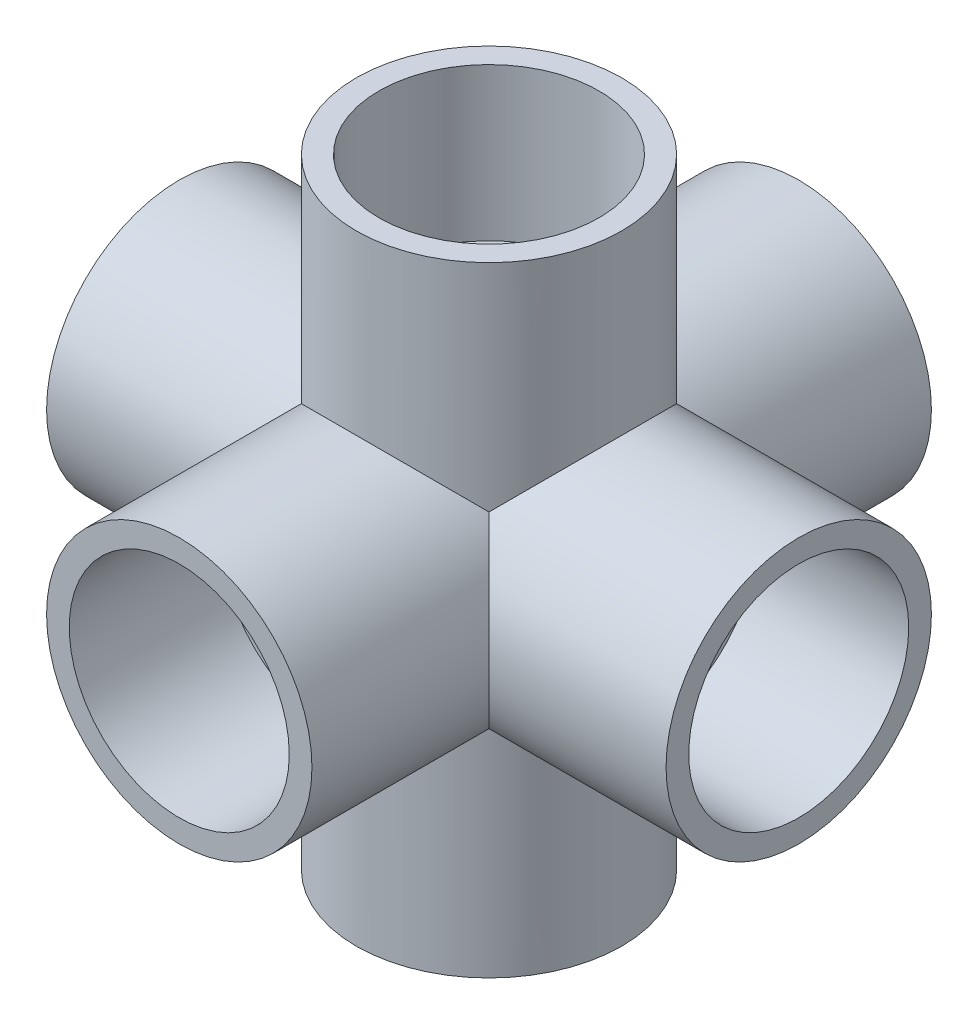
ISO-10303-21;
HEADER;
FILE_DESCRIPTION(('STEP AP214'),'2;1');
FILE_NAME('part.step','',(''),(''),'','','');
FILE_SCHEMA(('AUTOMOTIVE_DESIGN { 1 0 10303 214 1 1 1 1 }'));
ENDSEC;
DATA;
#1=APPLICATION_CONTEXT('core data for automotive mechanical design processes');
#2=APPLICATION_PROTOCOL_DEFINITION('international standard','automotive_design',2000,#1);
#3=PRODUCT_CONTEXT('',#1,'mechanical');
#4=PRODUCT('Part','Part','',(#3));
#5=PRODUCT_RELATED_PRODUCT_CATEGORY('part','',(#4));
#6=PRODUCT_DEFINITION_FORMATION('','',#4);
#7=PRODUCT_DEFINITION_CONTEXT('part definition',#1,'design');
#8=PRODUCT_DEFINITION('design','',#6,#7);
#9=PRODUCT_DEFINITION_SHAPE('','',#8);
#10=(LENGTH_UNIT() NAMED_UNIT(*) SI_UNIT(.MILLI.,.METRE.));
#11=(NAMED_UNIT(*) PLANE_ANGLE_UNIT() SI_UNIT($,.RADIAN.));
#12=(NAMED_UNIT(*) SI_UNIT($,.STERADIAN.) SOLID_ANGLE_UNIT());
#13=UNCERTAINTY_MEASURE_WITH_UNIT(LENGTH_MEASURE(1.E-05),#10,'distance_accuracy_value','');
#14=(GEOMETRIC_REPRESENTATION_CONTEXT(3) GLOBAL_UNCERTAINTY_ASSIGNED_CONTEXT((#13)) GLOBAL_UNIT_ASSIGNED_CONTEXT((#10,
#11,#12)) REPRESENTATION_CONTEXT('',''));
#15=CARTESIAN_POINT('',(0.,0.,0.));
#16=DIRECTION('',(0.,0.,1.));
#17=DIRECTION('',(1.,0.,0.));
#18=AXIS2_PLACEMENT_3D('',#15,#16,#17);
#19=CARTESIAN_POINT('',(0.,0.,45.05));
#20=DIRECTION('',(0.,0.,-1.));
#21=DIRECTION('',(-1.,0.,0.));
#22=AXIS2_PLACEMENT_3D('',#19,#20,#21);
#23=CYLINDRICAL_SURFACE('',#22,13.6);
#24=CARTESIAN_POINT('',(0.,0.,0.));
#25=DIRECTION('',(0.,-0.707106781186547,0.707106781186547));
#26=DIRECTION('',(0.,-0.707106781186547,-0.707106781186547));
#27=AXIS2_PLACEMENT_3D('',#24,#25,#26);
#28=ELLIPSE('',#27,19.2333044482741,13.6);
#29=CARTESIAN_POINT('',(-9.61665222413705,9.61665222413705,9.61665222413705));
#30=VERTEX_POINT('',#29);
#31=CARTESIAN_POINT('',(9.61665222413705,9.61665222413705,9.61665222413705));
#32=VERTEX_POINT('',#31);
#33=EDGE_CURVE('E139',#30,#32,#28,.F.);
#34=ORIENTED_EDGE('',*,*,#33,.T.);
#35=CARTESIAN_POINT('',(0.,0.,0.));
#36=DIRECTION('',(-0.707106781186547,0.,0.707106781186547));
#37=DIRECTION('',(-0.707106781186547,0.,-0.707106781186547));
#38=AXIS2_PLACEMENT_3D('',#35,#36,#37);
#39=ELLIPSE('',#38,19.2333044482741,13.6);
#40=CARTESIAN_POINT('',(9.61665222413705,-9.61665222413705,9.61665222413705));
#41=VERTEX_POINT('',#40);
#42=EDGE_CURVE('E76',#32,#41,#39,.F.);
#43=ORIENTED_EDGE('',*,*,#42,.T.);
#44=CARTESIAN_POINT('',(0.,0.,0.));
#45=DIRECTION('',(0.,-0.707106781186547,-0.707106781186547));
#46=DIRECTION('',(0.,-0.707106781186547,0.707106781186547));
#47=AXIS2_PLACEMENT_3D('',#44,#45,#46);
#48=ELLIPSE('',#47,19.2333044482741,13.6);
#49=CARTESIAN_POINT('',(-9.61665222413705,-9.61665222413705,9.61665222413705));
#50=VERTEX_POINT('',#49);
#51=EDGE_CURVE('E68',#41,#50,#48,.T.);
#52=ORIENTED_EDGE('',*,*,#51,.T.);
#53=CARTESIAN_POINT('',(0.,0.,0.));
#54=DIRECTION('',(-0.707106781186547,0.,-0.707106781186547));
#55=DIRECTION('',(-0.707106781186547,0.,0.707106781186547));
#56=AXIS2_PLACEMENT_3D('',#53,#54,#55);
#57=ELLIPSE('',#56,19.2333044482741,13.6);
#58=EDGE_CURVE('E124',#50,#30,#57,.T.);
#59=ORIENTED_EDGE('',*,*,#58,.T.);
#60=EDGE_LOOP('',(#34,#43,#52,#59));
#61=FACE_BOUND('',#60,.T.);
#62=CARTESIAN_POINT('',(0.,0.,22.85));
#63=DIRECTION('',(0.,0.,1.));
#64=DIRECTION('',(1.,0.,0.));
#65=AXIS2_PLACEMENT_3D('',#62,#63,#64);
#66=CIRCLE('',#65,13.6);
#67=CARTESIAN_POINT('',(13.6,0.,22.85));
#68=VERTEX_POINT('',#67);
#69=EDGE_CURVE('E63',#68,#68,#66,.T.);
#70=ORIENTED_EDGE('',*,*,#69,.T.);
#71=EDGE_LOOP('',(#70));
#72=FACE_BOUND('',#71,.T.);
#73=ADVANCED_FACE('F59',(#61,#72),#23,.F.);
#74=CARTESIAN_POINT('',(45.05,0.,0.));
#75=DIRECTION('',(-1.,0.,0.));
#76=DIRECTION('',(0.,0.,1.));
#77=AXIS2_PLACEMENT_3D('',#74,#75,#76);
#78=CYLINDRICAL_SURFACE('',#77,13.6);
#79=ORIENTED_EDGE('',*,*,#42,.F.);
#80=CARTESIAN_POINT('',(0.,0.,0.));
#81=DIRECTION('',(0.707106781186547,-0.707106781186547,0.));
#82=DIRECTION('',(-0.707106781186547,-0.707106781186547,0.));
#83=AXIS2_PLACEMENT_3D('',#80,#81,#82);
#84=ELLIPSE('',#83,19.2333044482741,13.6);
#85=CARTESIAN_POINT('',(9.61665222413705,9.61665222413705,-9.61665222413705));
#86=VERTEX_POINT('',#85);
#87=EDGE_CURVE('E130',#32,#86,#84,.F.);
#88=ORIENTED_EDGE('',*,*,#87,.T.);
#89=CARTESIAN_POINT('',(0.,0.,0.));
#90=DIRECTION('',(-0.707106781186547,0.,-0.707106781186547));
#91=DIRECTION('',(-0.707106781186547,0.,0.707106781186547));
#92=AXIS2_PLACEMENT_3D('',#89,#90,#91);
#93=ELLIPSE('',#92,19.2333044482741,13.6);
#94=CARTESIAN_POINT('',(9.61665222413705,-9.61665222413705,-9.61665222413705));
#95=VERTEX_POINT('',#94);
#96=EDGE_CURVE('E193',#95,#86,#93,.F.);
#97=ORIENTED_EDGE('',*,*,#96,.F.);
#98=CARTESIAN_POINT('',(0.,0.,0.));
#99=DIRECTION('',(-0.707106781186547,-0.707106781186547,0.));
#100=DIRECTION('',(0.707106781186547,-0.707106781186547,0.));
#101=AXIS2_PLACEMENT_3D('',#98,#99,#100);
#102=ELLIPSE('',#101,19.2333044482741,13.6);
#103=EDGE_CURVE('E142',#95,#41,#102,.T.);
#104=ORIENTED_EDGE('',*,*,#103,.T.);
#105=EDGE_LOOP('',(#79,#88,#97,#104));
#106=FACE_BOUND('',#105,.T.);
#107=CARTESIAN_POINT('',(22.85,0.,0.));
#108=DIRECTION('',(1.,0.,0.));
#109=DIRECTION('',(0.,0.,-1.));
#110=AXIS2_PLACEMENT_3D('',#107,#108,#109);
#111=CIRCLE('',#110,13.6);
#112=CARTESIAN_POINT('',(22.85,0.,-13.6));
#113=VERTEX_POINT('',#112);
#114=EDGE_CURVE('E162',#113,#113,#111,.T.);
#115=ORIENTED_EDGE('',*,*,#114,.T.);
#116=EDGE_LOOP('',(#115));
#117=FACE_BOUND('',#116,.T.);
#118=ADVANCED_FACE('F277',(#106,#117),#78,.F.);
#119=CARTESIAN_POINT('',(0.,45.05,0.));
#120=DIRECTION('',(0.,-1.,0.));
#121=DIRECTION('',(0.,0.,-1.));
#122=AXIS2_PLACEMENT_3D('',#119,#120,#121);
#123=CYLINDRICAL_SURFACE('',#122,13.6);
#124=ORIENTED_EDGE('',*,*,#33,.F.);
#125=CARTESIAN_POINT('',(0.,0.,0.));
#126=DIRECTION('',(-0.707106781186547,-0.707106781186547,0.));
#127=DIRECTION('',(0.707106781186547,-0.707106781186547,0.));
#128=AXIS2_PLACEMENT_3D('',#125,#126,#127);
#129=ELLIPSE('',#128,19.2333044482741,13.6);
#130=CARTESIAN_POINT('',(-9.61665222413705,9.61665222413705,-9.61665222413705));
#131=VERTEX_POINT('',#130);
#132=EDGE_CURVE('E138',#131,#30,#129,.F.);
#133=ORIENTED_EDGE('',*,*,#132,.F.);
#134=CARTESIAN_POINT('',(0.,0.,0.));
#135=DIRECTION('',(0.,-0.707106781186547,-0.707106781186547));
#136=DIRECTION('',(0.,-0.707106781186547,0.707106781186547));
#137=AXIS2_PLACEMENT_3D('',#134,#135,#136);
#138=ELLIPSE('',#137,19.2333044482741,13.6);
#139=EDGE_CURVE('E196',#86,#131,#138,.F.);
#140=ORIENTED_EDGE('',*,*,#139,.F.);
#141=ORIENTED_EDGE('',*,*,#87,.F.);
#142=EDGE_LOOP('',(#124,#133,#140,#141));
#143=FACE_BOUND('',#142,.T.);
#144=CARTESIAN_POINT('',(0.,22.85,0.));
#145=DIRECTION('',(0.,1.,0.));
#146=DIRECTION('',(0.,0.,1.));
#147=AXIS2_PLACEMENT_3D('',#144,#145,#146);
#148=CIRCLE('',#147,13.6);
#149=CARTESIAN_POINT('',(0.,22.85,13.6));
#150=VERTEX_POINT('',#149);
#151=EDGE_CURVE('E153',#150,#150,#148,.T.);
#152=ORIENTED_EDGE('',*,*,#151,.T.);
#153=EDGE_LOOP('',(#152));
#154=FACE_BOUND('',#153,.T.);
#155=ADVANCED_FACE('F283',(#143,#154),#123,.F.);
#156=CARTESIAN_POINT('',(0.,45.05,0.));
#157=DIRECTION('',(0.,-1.,0.));
#158=DIRECTION('',(0.,0.,-1.));
#159=AXIS2_PLACEMENT_3D('',#156,#157,#158);
#160=CYLINDRICAL_SURFACE('',#159,19.3);
#161=CARTESIAN_POINT('',(0.,45.05,0.));
#162=DIRECTION('',(0.,1.,0.));
#163=DIRECTION('',(0.,0.,1.));
#164=AXIS2_PLACEMENT_3D('',#161,#162,#163);
#165=CIRCLE('',#164,19.3);
#166=CARTESIAN_POINT('',(0.,45.05,19.3));
#167=VERTEX_POINT('',#166);
#168=EDGE_CURVE('E250',#167,#167,#165,.T.);
#169=ORIENTED_EDGE('',*,*,#168,.F.);
#170=EDGE_LOOP('',(#169));
#171=FACE_BOUND('',#170,.T.);
#172=CARTESIAN_POINT('',(0.,0.,0.));
#173=DIRECTION('',(0.,-0.707106781186547,-0.707106781186547));
#174=DIRECTION('',(0.,-0.707106781186547,0.707106781186547));
#175=AXIS2_PLACEMENT_3D('',#172,#173,#174);
#176=ELLIPSE('',#175,27.2943217538007,19.3);
#177=CARTESIAN_POINT('',(-13.6471608769004,13.6471608769004,-13.6471608769004));
#178=VERTEX_POINT('',#177);
#179=CARTESIAN_POINT('',(13.6471608769004,13.6471608769004,-13.6471608769004));
#180=VERTEX_POINT('',#179);
#181=EDGE_CURVE('E216',#178,#180,#176,.T.);
#182=ORIENTED_EDGE('',*,*,#181,.F.);
#183=CARTESIAN_POINT('',(0.,0.,0.));
#184=DIRECTION('',(-0.707106781186547,-0.707106781186547,0.));
#185=DIRECTION('',(0.707106781186547,-0.707106781186547,0.));
#186=AXIS2_PLACEMENT_3D('',#183,#184,#185);
#187=ELLIPSE('',#186,27.2943217538007,19.3);
#188=CARTESIAN_POINT('',(-13.6471608769004,13.6471608769004,13.6471608769004));
#189=VERTEX_POINT('',#188);
#190=EDGE_CURVE('E243',#189,#178,#187,.T.);
#191=ORIENTED_EDGE('',*,*,#190,.F.);
#192=CARTESIAN_POINT('',(0.,0.,0.));
#193=DIRECTION('',(0.,-0.707106781186547,0.707106781186547));
#194=DIRECTION('',(0.,-0.707106781186547,-0.707106781186547));
#195=AXIS2_PLACEMENT_3D('',#192,#193,#194);
#196=ELLIPSE('',#195,27.2943217538007,19.3);
#197=CARTESIAN_POINT('',(13.6471608769004,13.6471608769004,13.6471608769004));
#198=VERTEX_POINT('',#197);
#199=EDGE_CURVE('E228',#198,#189,#196,.T.);
#200=ORIENTED_EDGE('',*,*,#199,.F.);
#201=CARTESIAN_POINT('',(0.,0.,0.));
#202=DIRECTION('',(0.707106781186547,-0.707106781186547,0.));
#203=DIRECTION('',(-0.707106781186547,-0.707106781186547,0.));
#204=AXIS2_PLACEMENT_3D('',#201,#202,#203);
#205=ELLIPSE('',#204,27.2943217538007,19.3);
#206=EDGE_CURVE('E240',#180,#198,#205,.T.);
#207=ORIENTED_EDGE('',*,*,#206,.F.);
#208=EDGE_LOOP('',(#182,#191,#200,#207));
#209=FACE_BOUND('',#208,.T.);
#210=ADVANCED_FACE('F61',(#171,#209),#160,.T.);
#211=CARTESIAN_POINT('',(45.05,0.,0.));
#212=DIRECTION('',(-1.,0.,0.));
#213=DIRECTION('',(0.,0.,1.));
#214=AXIS2_PLACEMENT_3D('',#211,#212,#213);
#215=CYLINDRICAL_SURFACE('',#214,19.3);
#216=CARTESIAN_POINT('',(-45.05,0.,0.));
#217=DIRECTION('',(1.,0.,0.));
#218=DIRECTION('',(0.,0.,-1.));
#219=AXIS2_PLACEMENT_3D('',#216,#217,#218);
#220=CIRCLE('',#219,19.3);
#221=CARTESIAN_POINT('',(-45.05,0.,-19.3));
#222=VERTEX_POINT('',#221);
#223=EDGE_CURVE('E231',#222,#222,#220,.T.);
#224=ORIENTED_EDGE('',*,*,#223,.T.);
#225=EDGE_LOOP('',(#224));
#226=FACE_BOUND('',#225,.T.);
#227=CARTESIAN_POINT('',(0.,0.,0.));
#228=DIRECTION('',(-0.707106781186547,0.,-0.707106781186547));
#229=DIRECTION('',(-0.707106781186547,0.,0.707106781186547));
#230=AXIS2_PLACEMENT_3D('',#227,#228,#229);
#231=ELLIPSE('',#230,27.2943217538007,19.3);
#232=CARTESIAN_POINT('',(-13.6471608769004,-13.6471608769004,13.6471608769004));
#233=VERTEX_POINT('',#232);
#234=EDGE_CURVE('E225',#189,#233,#231,.F.);
#235=ORIENTED_EDGE('',*,*,#234,.F.);
#236=ORIENTED_EDGE('',*,*,#190,.T.);
#237=CARTESIAN_POINT('',(0.,0.,0.));
#238=DIRECTION('',(-0.707106781186547,0.,0.707106781186547));
#239=DIRECTION('',(-0.707106781186547,0.,-0.707106781186547));
#240=AXIS2_PLACEMENT_3D('',#237,#238,#239);
#241=ELLIPSE('',#240,27.2943217538007,19.3);
#242=CARTESIAN_POINT('',(-13.6471608769004,-13.6471608769004,-13.6471608769004));
#243=VERTEX_POINT('',#242);
#244=EDGE_CURVE('E213',#243,#178,#241,.F.);
#245=ORIENTED_EDGE('',*,*,#244,.F.);
#246=CARTESIAN_POINT('',(0.,0.,0.));
#247=DIRECTION('',(0.707106781186547,-0.707106781186547,0.));
#248=DIRECTION('',(-0.707106781186547,-0.707106781186547,0.));
#249=AXIS2_PLACEMENT_3D('',#246,#247,#248);
#250=ELLIPSE('',#249,27.2943217538007,19.3);
#251=EDGE_CURVE('E235',#243,#233,#250,.F.);
#252=ORIENTED_EDGE('',*,*,#251,.T.);
#253=EDGE_LOOP('',(#235,#236,#245,#252));
#254=FACE_BOUND('',#253,.T.);
#255=ADVANCED_FACE('F329',(#226,#254),#215,.T.);
#256=CARTESIAN_POINT('',(-22.85,0.,0.));
#257=DIRECTION('',(1.,0.,0.));
#258=DIRECTION('',(0.,0.,-1.));
#259=AXIS2_PLACEMENT_3D('',#256,#257,#258);
#260=CIRCLE('',#259,13.6);
#261=CARTESIAN_POINT('',(-22.85,0.,-13.6));
#262=VERTEX_POINT('',#261);
#263=EDGE_CURVE('E158',#262,#262,#260,.T.);
#264=ORIENTED_EDGE('',*,*,#263,.F.);
#265=EDGE_LOOP('',(#264));
#266=FACE_BOUND('',#265,.T.);
#267=CARTESIAN_POINT('',(0.,0.,0.));
#268=DIRECTION('',(-0.707106781186547,0.,0.707106781186547));
#269=DIRECTION('',(-0.707106781186547,0.,-0.707106781186547));
#270=AXIS2_PLACEMENT_3D('',#267,#268,#269);
#271=ELLIPSE('',#270,19.2333044482741,13.6);
#272=CARTESIAN_POINT('',(-9.61665222413705,-9.61665222413705,-9.61665222413705));
#273=VERTEX_POINT('',#272);
#274=EDGE_CURVE('E83',#131,#273,#271,.T.);
#275=ORIENTED_EDGE('',*,*,#274,.F.);
#276=ORIENTED_EDGE('',*,*,#132,.T.);
#277=ORIENTED_EDGE('',*,*,#58,.F.);
#278=CARTESIAN_POINT('',(0.,0.,0.));
#279=DIRECTION('',(0.707106781186547,-0.707106781186547,0.));
#280=DIRECTION('',(-0.707106781186547,-0.707106781186547,0.));
#281=AXIS2_PLACEMENT_3D('',#278,#279,#280);
#282=ELLIPSE('',#281,19.2333044482741,13.6);
#283=EDGE_CURVE('E136',#50,#273,#282,.T.);
#284=ORIENTED_EDGE('',*,*,#283,.T.);
#285=EDGE_LOOP('',(#275,#276,#277,#284));
#286=FACE_BOUND('',#285,.T.);
#287=ADVANCED_FACE('F135',(#266,#286),#78,.F.);
#288=CARTESIAN_POINT('',(45.05,0.,0.));
#289=DIRECTION('',(1.,0.,0.));
#290=DIRECTION('',(0.,0.,-1.));
#291=AXIS2_PLACEMENT_3D('',#288,#289,#290);
#292=CIRCLE('',#291,19.3);
#293=CARTESIAN_POINT('',(45.05,0.,-19.3));
#294=VERTEX_POINT('',#293);
#295=EDGE_CURVE('E232',#294,#294,#292,.T.);
#296=ORIENTED_EDGE('',*,*,#295,.F.);
#297=EDGE_LOOP('',(#296));
#298=FACE_BOUND('',#297,.T.);
#299=CARTESIAN_POINT('',(0.,0.,0.));
#300=DIRECTION('',(-0.707106781186547,0.,-0.707106781186547));
#301=DIRECTION('',(-0.707106781186547,0.,0.707106781186547));
#302=AXIS2_PLACEMENT_3D('',#299,#300,#301);
#303=ELLIPSE('',#302,27.2943217538007,19.3);
#304=CARTESIAN_POINT('',(13.6471608769004,-13.6471608769004,-13.6471608769004));
#305=VERTEX_POINT('',#304);
#306=EDGE_CURVE('E210',#180,#305,#303,.T.);
#307=ORIENTED_EDGE('',*,*,#306,.F.);
#308=ORIENTED_EDGE('',*,*,#206,.T.);
#309=CARTESIAN_POINT('',(0.,0.,0.));
#310=DIRECTION('',(-0.707106781186547,0.,0.707106781186547));
#311=DIRECTION('',(-0.707106781186547,0.,-0.707106781186547));
#312=AXIS2_PLACEMENT_3D('',#309,#310,#311);
#313=ELLIPSE('',#312,27.2943217538007,19.3);
#314=CARTESIAN_POINT('',(13.6471608769004,-13.6471608769004,13.6471608769004));
#315=VERTEX_POINT('',#314);
#316=EDGE_CURVE('E222',#315,#198,#313,.T.);
#317=ORIENTED_EDGE('',*,*,#316,.F.);
#318=CARTESIAN_POINT('',(0.,0.,0.));
#319=DIRECTION('',(-0.707106781186547,-0.707106781186547,0.));
#320=DIRECTION('',(0.707106781186547,-0.707106781186547,0.));
#321=AXIS2_PLACEMENT_3D('',#318,#319,#320);
#322=ELLIPSE('',#321,27.2943217538007,19.3);
#323=EDGE_CURVE('E246',#315,#305,#322,.F.);
#324=ORIENTED_EDGE('',*,*,#323,.T.);
#325=EDGE_LOOP('',(#307,#308,#317,#324));
#326=FACE_BOUND('',#325,.T.);
#327=ADVANCED_FACE('F337',(#298,#326),#215,.T.);
#328=CARTESIAN_POINT('',(0.,-45.05,0.));
#329=DIRECTION('',(0.,1.,0.));
#330=DIRECTION('',(0.,0.,1.));
#331=AXIS2_PLACEMENT_3D('',#328,#329,#330);
#332=CIRCLE('',#331,19.3);
#333=CARTESIAN_POINT('',(0.,-45.05,19.3));
#334=VERTEX_POINT('',#333);
#335=EDGE_CURVE('E249',#334,#334,#332,.T.);
#336=ORIENTED_EDGE('',*,*,#335,.T.);
#337=EDGE_LOOP('',(#336));
#338=FACE_BOUND('',#337,.T.);
#339=CARTESIAN_POINT('',(0.,0.,0.));
#340=DIRECTION('',(0.,-0.707106781186547,-0.707106781186547));
#341=DIRECTION('',(0.,-0.707106781186547,0.707106781186547));
#342=AXIS2_PLACEMENT_3D('',#339,#340,#341);
#343=ELLIPSE('',#342,27.2943217538007,19.3);
#344=EDGE_CURVE('E219',#233,#315,#343,.F.);
#345=ORIENTED_EDGE('',*,*,#344,.F.);
#346=ORIENTED_EDGE('',*,*,#251,.F.);
#347=CARTESIAN_POINT('',(0.,0.,0.));
#348=DIRECTION('',(0.,-0.707106781186547,0.707106781186547));
#349=DIRECTION('',(0.,-0.707106781186547,-0.707106781186547));
#350=AXIS2_PLACEMENT_3D('',#347,#348,#349);
#351=ELLIPSE('',#350,27.2943217538007,19.3);
#352=EDGE_CURVE('E205',#305,#243,#351,.F.);
#353=ORIENTED_EDGE('',*,*,#352,.F.);
#354=ORIENTED_EDGE('',*,*,#323,.F.);
#355=EDGE_LOOP('',(#345,#346,#353,#354));
#356=FACE_BOUND('',#355,.T.);
#357=ADVANCED_FACE('F256',(#338,#356),#160,.T.);
#358=CARTESIAN_POINT('',(0.,45.05,0.));
#359=DIRECTION('',(0.,1.,0.));
#360=DIRECTION('',(0.,0.,1.));
#361=AXIS2_PLACEMENT_3D('',#358,#359,#360);
#362=PLANE('',#361);
#363=CARTESIAN_POINT('',(0.,45.05,0.));
#364=DIRECTION('',(0.,1.,0.));
#365=DIRECTION('',(0.,0.,1.));
#366=AXIS2_PLACEMENT_3D('',#363,#364,#365);
#367=CIRCLE('',#366,16.);
#368=CARTESIAN_POINT('',(0.,45.05,16.));
#369=VERTEX_POINT('',#368);
#370=EDGE_CURVE('E160',#369,#369,#367,.T.);
#371=ORIENTED_EDGE('',*,*,#370,.F.);
#372=EDGE_LOOP('',(#371));
#373=FACE_BOUND('',#372,.T.);
#374=ORIENTED_EDGE('',*,*,#168,.T.);
#375=EDGE_LOOP('',(#374));
#376=FACE_BOUND('',#375,.T.);
#377=ADVANCED_FACE('F322',(#373,#376),#362,.T.);
#378=CARTESIAN_POINT('',(-45.05,0.,0.));
#379=DIRECTION('',(1.,0.,0.));
#380=DIRECTION('',(0.,0.,-1.));
#381=AXIS2_PLACEMENT_3D('',#378,#379,#380);
#382=PLANE('',#381);
#383=CARTESIAN_POINT('',(-45.05,0.,0.));
#384=DIRECTION('',(1.,0.,0.));
#385=DIRECTION('',(0.,0.,-1.));
#386=AXIS2_PLACEMENT_3D('',#383,#384,#385);
#387=CIRCLE('',#386,16.);
#388=CARTESIAN_POINT('',(-45.05,0.,-16.));
#389=VERTEX_POINT('',#388);
#390=EDGE_CURVE('E164',#389,#389,#387,.T.);
#391=ORIENTED_EDGE('',*,*,#390,.T.);
#392=EDGE_LOOP('',(#391));
#393=FACE_BOUND('',#392,.T.);
#394=ORIENTED_EDGE('',*,*,#223,.F.);
#395=EDGE_LOOP('',(#394));
#396=FACE_BOUND('',#395,.T.);
#397=ADVANCED_FACE('F272',(#393,#396),#382,.F.);
#398=CARTESIAN_POINT('',(45.05,0.,0.));
#399=DIRECTION('',(1.,0.,0.));
#400=DIRECTION('',(0.,0.,-1.));
#401=AXIS2_PLACEMENT_3D('',#398,#399,#400);
#402=PLANE('',#401);
#403=CARTESIAN_POINT('',(45.05,0.,0.));
#404=DIRECTION('',(1.,0.,0.));
#405=DIRECTION('',(0.,0.,-1.));
#406=AXIS2_PLACEMENT_3D('',#403,#404,#405);
#407=CIRCLE('',#406,16.);
#408=CARTESIAN_POINT('',(45.05,0.,-16.));
#409=VERTEX_POINT('',#408);
#410=EDGE_CURVE('E171',#409,#409,#407,.T.);
#411=ORIENTED_EDGE('',*,*,#410,.F.);
#412=EDGE_LOOP('',(#411));
#413=FACE_BOUND('',#412,.T.);
#414=ORIENTED_EDGE('',*,*,#295,.T.);
#415=EDGE_LOOP('',(#414));
#416=FACE_BOUND('',#415,.T.);
#417=ADVANCED_FACE('F262',(#413,#416),#402,.T.);
#418=CARTESIAN_POINT('',(0.,-45.05,0.));
#419=DIRECTION('',(0.,1.,0.));
#420=DIRECTION('',(0.,0.,1.));
#421=AXIS2_PLACEMENT_3D('',#418,#419,#420);
#422=PLANE('',#421);
#423=CARTESIAN_POINT('',(0.,-45.05,0.));
#424=DIRECTION('',(0.,1.,0.));
#425=DIRECTION('',(0.,0.,1.));
#426=AXIS2_PLACEMENT_3D('',#423,#424,#425);
#427=CIRCLE('',#426,16.);
#428=CARTESIAN_POINT('',(0.,-45.05,16.));
#429=VERTEX_POINT('',#428);
#430=EDGE_CURVE('E156',#429,#429,#427,.T.);
#431=ORIENTED_EDGE('',*,*,#430,.T.);
#432=EDGE_LOOP('',(#431));
#433=FACE_BOUND('',#432,.T.);
#434=ORIENTED_EDGE('',*,*,#335,.F.);
#435=EDGE_LOOP('',(#434));
#436=FACE_BOUND('',#435,.T.);
#437=ADVANCED_FACE('F259',(#433,#436),#422,.F.);
#438=CARTESIAN_POINT('',(0.,0.,45.05));
#439=DIRECTION('',(0.,0.,-1.));
#440=DIRECTION('',(-1.,0.,0.));
#441=AXIS2_PLACEMENT_3D('',#438,#439,#440);
#442=CYLINDRICAL_SURFACE('',#441,19.3);
#443=CARTESIAN_POINT('',(0.,0.,45.05));
#444=DIRECTION('',(0.,0.,1.));
#445=DIRECTION('',(1.,0.,0.));
#446=AXIS2_PLACEMENT_3D('',#443,#444,#445);
#447=CIRCLE('',#446,19.3);
#448=CARTESIAN_POINT('',(19.3,0.,45.05));
#449=VERTEX_POINT('',#448);
#450=EDGE_CURVE('E202',#449,#449,#447,.T.);
#451=ORIENTED_EDGE('',*,*,#450,.F.);
#452=EDGE_LOOP('',(#451));
#453=FACE_BOUND('',#452,.T.);
#454=ORIENTED_EDGE('',*,*,#316,.T.);
#455=ORIENTED_EDGE('',*,*,#199,.T.);
#456=ORIENTED_EDGE('',*,*,#234,.T.);
#457=ORIENTED_EDGE('',*,*,#344,.T.);
#458=EDGE_LOOP('',(#454,#455,#456,#457));
#459=FACE_BOUND('',#458,.T.);
#460=ADVANCED_FACE('F261',(#453,#459),#442,.T.);
#461=CARTESIAN_POINT('',(0.,0.,45.05));
#462=DIRECTION('',(0.,0.,1.));
#463=DIRECTION('',(1.,0.,0.));
#464=AXIS2_PLACEMENT_3D('',#461,#462,#463);
#465=PLANE('',#464);
#466=CARTESIAN_POINT('',(0.,0.,45.05));
#467=DIRECTION('',(0.,0.,1.));
#468=DIRECTION('',(1.,0.,0.));
#469=AXIS2_PLACEMENT_3D('',#466,#467,#468);
#470=CIRCLE('',#469,16.);
#471=CARTESIAN_POINT('',(16.,0.,45.05));
#472=VERTEX_POINT('',#471);
#473=EDGE_CURVE('E178',#472,#472,#470,.T.);
#474=ORIENTED_EDGE('',*,*,#473,.F.);
#475=EDGE_LOOP('',(#474));
#476=FACE_BOUND('',#475,.T.);
#477=ORIENTED_EDGE('',*,*,#450,.T.);
#478=EDGE_LOOP('',(#477));
#479=FACE_BOUND('',#478,.T.);
#480=ADVANCED_FACE('F268',(#476,#479),#465,.T.);
#481=CARTESIAN_POINT('',(0.,0.,-45.05));
#482=DIRECTION('',(0.,0.,1.));
#483=DIRECTION('',(1.,0.,0.));
#484=AXIS2_PLACEMENT_3D('',#481,#482,#483);
#485=PLANE('',#484);
#486=CARTESIAN_POINT('',(0.,0.,-45.05));
#487=DIRECTION('',(0.,0.,1.));
#488=DIRECTION('',(1.,0.,0.));
#489=AXIS2_PLACEMENT_3D('',#486,#487,#488);
#490=CIRCLE('',#489,19.3);
#491=CARTESIAN_POINT('',(19.3,0.,-45.05));
#492=VERTEX_POINT('',#491);
#493=EDGE_CURVE('E201',#492,#492,#490,.T.);
#494=ORIENTED_EDGE('',*,*,#493,.F.);
#495=EDGE_LOOP('',(#494));
#496=FACE_BOUND('',#495,.T.);
#497=CARTESIAN_POINT('',(0.,0.,-45.05));
#498=DIRECTION('',(0.,0.,1.));
#499=DIRECTION('',(1.,0.,0.));
#500=AXIS2_PLACEMENT_3D('',#497,#498,#499);
#501=CIRCLE('',#500,13.6);
#502=CARTESIAN_POINT('',(13.6,0.,-45.05));
#503=VERTEX_POINT('',#502);
#504=EDGE_CURVE('E198',#503,#503,#501,.T.);
#505=ORIENTED_EDGE('',*,*,#504,.T.);
#506=EDGE_LOOP('',(#505));
#507=FACE_BOUND('',#506,.T.);
#508=ADVANCED_FACE('F289',(#496,#507),#485,.F.);
#509=ORIENTED_EDGE('',*,*,#504,.F.);
#510=EDGE_LOOP('',(#509));
#511=FACE_BOUND('',#510,.T.);
#512=ORIENTED_EDGE('',*,*,#139,.T.);
#513=ORIENTED_EDGE('',*,*,#274,.T.);
#514=CARTESIAN_POINT('',(0.,0.,0.));
#515=DIRECTION('',(0.,-0.707106781186547,0.707106781186547));
#516=DIRECTION('',(0.,-0.707106781186547,-0.707106781186547));
#517=AXIS2_PLACEMENT_3D('',#514,#515,#516);
#518=ELLIPSE('',#517,19.2333044482741,13.6);
#519=EDGE_CURVE('E12',#273,#95,#518,.T.);
#520=ORIENTED_EDGE('',*,*,#519,.T.);
#521=ORIENTED_EDGE('',*,*,#96,.T.);
#522=EDGE_LOOP('',(#512,#513,#520,#521));
#523=FACE_BOUND('',#522,.T.);
#524=ADVANCED_FACE('F279',(#511,#523),#23,.F.);
#525=ORIENTED_EDGE('',*,*,#493,.T.);
#526=EDGE_LOOP('',(#525));
#527=FACE_BOUND('',#526,.T.);
#528=ORIENTED_EDGE('',*,*,#244,.T.);
#529=ORIENTED_EDGE('',*,*,#181,.T.);
#530=ORIENTED_EDGE('',*,*,#306,.T.);
#531=ORIENTED_EDGE('',*,*,#352,.T.);
#532=EDGE_LOOP('',(#528,#529,#530,#531));
#533=FACE_BOUND('',#532,.T.);
#534=ADVANCED_FACE('F271',(#527,#533),#442,.T.);
#535=CARTESIAN_POINT('',(0.,-22.85,0.));
#536=DIRECTION('',(0.,1.,0.));
#537=DIRECTION('',(0.,0.,1.));
#538=AXIS2_PLACEMENT_3D('',#535,#536,#537);
#539=CIRCLE('',#538,13.6);
#540=CARTESIAN_POINT('',(0.,-22.85,13.6));
#541=VERTEX_POINT('',#540);
#542=EDGE_CURVE('E149',#541,#541,#539,.T.);
#543=ORIENTED_EDGE('',*,*,#542,.F.);
#544=EDGE_LOOP('',(#543));
#545=FACE_BOUND('',#544,.T.);
#546=ORIENTED_EDGE('',*,*,#519,.F.);
#547=ORIENTED_EDGE('',*,*,#283,.F.);
#548=ORIENTED_EDGE('',*,*,#51,.F.);
#549=ORIENTED_EDGE('',*,*,#103,.F.);
#550=EDGE_LOOP('',(#546,#547,#548,#549));
#551=FACE_BOUND('',#550,.T.);
#552=ADVANCED_FACE('F141',(#545,#551),#123,.F.);
#553=CARTESIAN_POINT('',(0.,-22.85,0.));
#554=DIRECTION('',(0.,-1.,0.));
#555=DIRECTION('',(0.,0.,-1.));
#556=AXIS2_PLACEMENT_3D('',#553,#554,#555);
#557=CYLINDRICAL_SURFACE('',#556,16.);
#558=CARTESIAN_POINT('',(0.,-22.85,0.));
#559=DIRECTION('',(0.,1.,0.));
#560=DIRECTION('',(0.,0.,1.));
#561=AXIS2_PLACEMENT_3D('',#558,#559,#560);
#562=CIRCLE('',#561,16.);
#563=CARTESIAN_POINT('',(0.,-22.85,16.));
#564=VERTEX_POINT('',#563);
#565=EDGE_CURVE('E152',#564,#564,#562,.T.);
#566=ORIENTED_EDGE('',*,*,#565,.T.);
#567=EDGE_LOOP('',(#566));
#568=FACE_BOUND('',#567,.T.);
#569=ORIENTED_EDGE('',*,*,#430,.F.);
#570=EDGE_LOOP('',(#569));
#571=FACE_BOUND('',#570,.T.);
#572=ADVANCED_FACE('F401',(#568,#571),#557,.F.);
#573=CARTESIAN_POINT('',(0.,-22.85,0.));
#574=DIRECTION('',(0.,1.,0.));
#575=DIRECTION('',(0.,0.,1.));
#576=AXIS2_PLACEMENT_3D('',#573,#574,#575);
#577=PLANE('',#576);
#578=ORIENTED_EDGE('',*,*,#542,.T.);
#579=EDGE_LOOP('',(#578));
#580=FACE_BOUND('',#579,.T.);
#581=ORIENTED_EDGE('',*,*,#565,.F.);
#582=EDGE_LOOP('',(#581));
#583=FACE_BOUND('',#582,.T.);
#584=ADVANCED_FACE('F318',(#580,#583),#577,.F.);
#585=CARTESIAN_POINT('',(0.,22.85,0.));
#586=DIRECTION('',(0.,1.,0.));
#587=DIRECTION('',(0.,0.,1.));
#588=AXIS2_PLACEMENT_3D('',#585,#586,#587);
#589=CYLINDRICAL_SURFACE('',#588,16.);
#590=CARTESIAN_POINT('',(0.,22.85,0.));
#591=DIRECTION('',(0.,1.,0.));
#592=DIRECTION('',(0.,0.,1.));
#593=AXIS2_PLACEMENT_3D('',#590,#591,#592);
#594=CIRCLE('',#593,16.);
#595=CARTESIAN_POINT('',(0.,22.85,16.));
#596=VERTEX_POINT('',#595);
#597=EDGE_CURVE('E157',#596,#596,#594,.T.);
#598=ORIENTED_EDGE('',*,*,#597,.F.);
#599=EDGE_LOOP('',(#598));
#600=FACE_BOUND('',#599,.T.);
#601=ORIENTED_EDGE('',*,*,#370,.T.);
#602=EDGE_LOOP('',(#601));
#603=FACE_BOUND('',#602,.T.);
#604=ADVANCED_FACE('F312',(#600,#603),#589,.F.);
#605=CARTESIAN_POINT('',(0.,22.85,0.));
#606=DIRECTION('',(0.,1.,0.));
#607=DIRECTION('',(0.,0.,1.));
#608=AXIS2_PLACEMENT_3D('',#605,#606,#607);
#609=PLANE('',#608);
#610=ORIENTED_EDGE('',*,*,#151,.F.);
#611=EDGE_LOOP('',(#610));
#612=FACE_BOUND('',#611,.T.);
#613=ORIENTED_EDGE('',*,*,#597,.T.);
#614=EDGE_LOOP('',(#613));
#615=FACE_BOUND('',#614,.T.);
#616=ADVANCED_FACE('F308',(#612,#615),#609,.T.);
#617=CARTESIAN_POINT('',(-22.85,0.,0.));
#618=DIRECTION('',(-1.,0.,0.));
#619=DIRECTION('',(0.,0.,1.));
#620=AXIS2_PLACEMENT_3D('',#617,#618,#619);
#621=CYLINDRICAL_SURFACE('',#620,16.);
#622=CARTESIAN_POINT('',(-22.85,0.,0.));
#623=DIRECTION('',(1.,0.,0.));
#624=DIRECTION('',(0.,0.,-1.));
#625=AXIS2_PLACEMENT_3D('',#622,#623,#624);
#626=CIRCLE('',#625,16.);
#627=CARTESIAN_POINT('',(-22.85,0.,-16.));
#628=VERTEX_POINT('',#627);
#629=EDGE_CURVE('E161',#628,#628,#626,.T.);
#630=ORIENTED_EDGE('',*,*,#629,.T.);
#631=EDGE_LOOP('',(#630));
#632=FACE_BOUND('',#631,.T.);
#633=ORIENTED_EDGE('',*,*,#390,.F.);
#634=EDGE_LOOP('',(#633));
#635=FACE_BOUND('',#634,.T.);
#636=ADVANCED_FACE('F311',(#632,#635),#621,.F.);
#637=CARTESIAN_POINT('',(-22.85,0.,0.));
#638=DIRECTION('',(1.,0.,0.));
#639=DIRECTION('',(0.,0.,-1.));
#640=AXIS2_PLACEMENT_3D('',#637,#638,#639);
#641=PLANE('',#640);
#642=ORIENTED_EDGE('',*,*,#263,.T.);
#643=EDGE_LOOP('',(#642));
#644=FACE_BOUND('',#643,.T.);
#645=ORIENTED_EDGE('',*,*,#629,.F.);
#646=EDGE_LOOP('',(#645));
#647=FACE_BOUND('',#646,.T.);
#648=ADVANCED_FACE('F392',(#644,#647),#641,.F.);
#649=CARTESIAN_POINT('',(22.85,0.,0.));
#650=DIRECTION('',(1.,0.,0.));
#651=DIRECTION('',(0.,0.,-1.));
#652=AXIS2_PLACEMENT_3D('',#649,#650,#651);
#653=CYLINDRICAL_SURFACE('',#652,16.);
#654=CARTESIAN_POINT('',(22.85,0.,0.));
#655=DIRECTION('',(1.,0.,0.));
#656=DIRECTION('',(0.,0.,-1.));
#657=AXIS2_PLACEMENT_3D('',#654,#655,#656);
#658=CIRCLE('',#657,16.);
#659=CARTESIAN_POINT('',(22.85,0.,-16.));
#660=VERTEX_POINT('',#659);
#661=EDGE_CURVE('E165',#660,#660,#658,.T.);
#662=ORIENTED_EDGE('',*,*,#661,.F.);
#663=EDGE_LOOP('',(#662));
#664=FACE_BOUND('',#663,.T.);
#665=ORIENTED_EDGE('',*,*,#410,.T.);
#666=EDGE_LOOP('',(#665));
#667=FACE_BOUND('',#666,.T.);
#668=ADVANCED_FACE('F388',(#664,#667),#653,.F.);
#669=CARTESIAN_POINT('',(22.85,0.,0.));
#670=DIRECTION('',(1.,0.,0.));
#671=DIRECTION('',(0.,0.,-1.));
#672=AXIS2_PLACEMENT_3D('',#669,#670,#671);
#673=PLANE('',#672);
#674=ORIENTED_EDGE('',*,*,#114,.F.);
#675=EDGE_LOOP('',(#674));
#676=FACE_BOUND('',#675,.T.);
#677=ORIENTED_EDGE('',*,*,#661,.T.);
#678=EDGE_LOOP('',(#677));
#679=FACE_BOUND('',#678,.T.);
#680=ADVANCED_FACE('F382',(#676,#679),#673,.T.);
#681=CARTESIAN_POINT('',(0.,0.,22.85));
#682=DIRECTION('',(0.,0.,1.));
#683=DIRECTION('',(1.,0.,0.));
#684=AXIS2_PLACEMENT_3D('',#681,#682,#683);
#685=CYLINDRICAL_SURFACE('',#684,16.);
#686=CARTESIAN_POINT('',(0.,0.,22.85));
#687=DIRECTION('',(0.,0.,1.));
#688=DIRECTION('',(1.,0.,0.));
#689=AXIS2_PLACEMENT_3D('',#686,#687,#688);
#690=CIRCLE('',#689,16.);
#691=CARTESIAN_POINT('',(16.,0.,22.85));
#692=VERTEX_POINT('',#691);
#693=EDGE_CURVE('E368',#692,#692,#690,.T.);
#694=ORIENTED_EDGE('',*,*,#693,.F.);
#695=EDGE_LOOP('',(#694));
#696=FACE_BOUND('',#695,.T.);
#697=ORIENTED_EDGE('',*,*,#473,.T.);
#698=EDGE_LOOP('',(#697));
#699=FACE_BOUND('',#698,.T.);
#700=ADVANCED_FACE('F377',(#696,#699),#685,.F.);
#701=CARTESIAN_POINT('',(0.,0.,22.85));
#702=DIRECTION('',(0.,0.,1.));
#703=DIRECTION('',(1.,0.,0.));
#704=AXIS2_PLACEMENT_3D('',#701,#702,#703);
#705=PLANE('',#704);
#706=ORIENTED_EDGE('',*,*,#69,.F.);
#707=EDGE_LOOP('',(#706));
#708=FACE_BOUND('',#707,.T.);
#709=ORIENTED_EDGE('',*,*,#693,.T.);
#710=EDGE_LOOP('',(#709));
#711=FACE_BOUND('',#710,.T.);
#712=ADVANCED_FACE('F375',(#708,#711),#705,.T.);
#713=CLOSED_SHELL('',(#73,#118,#155,#210,#255,#287,#327,#357,#377,#397,#417,#437,#460,#480,#508,
#524,#534,#552,#572,#584,#604,#616,#636,#648,#668,#680,#700,#712));
#714=MANIFOLD_SOLID_BREP('B2',#713);
#715=ADVANCED_BREP_SHAPE_REPRESENTATION('',(#18,#714),#14);
#716=SHAPE_DEFINITION_REPRESENTATION(#9,#715);
ENDSEC;
END-ISO-10303-21;
